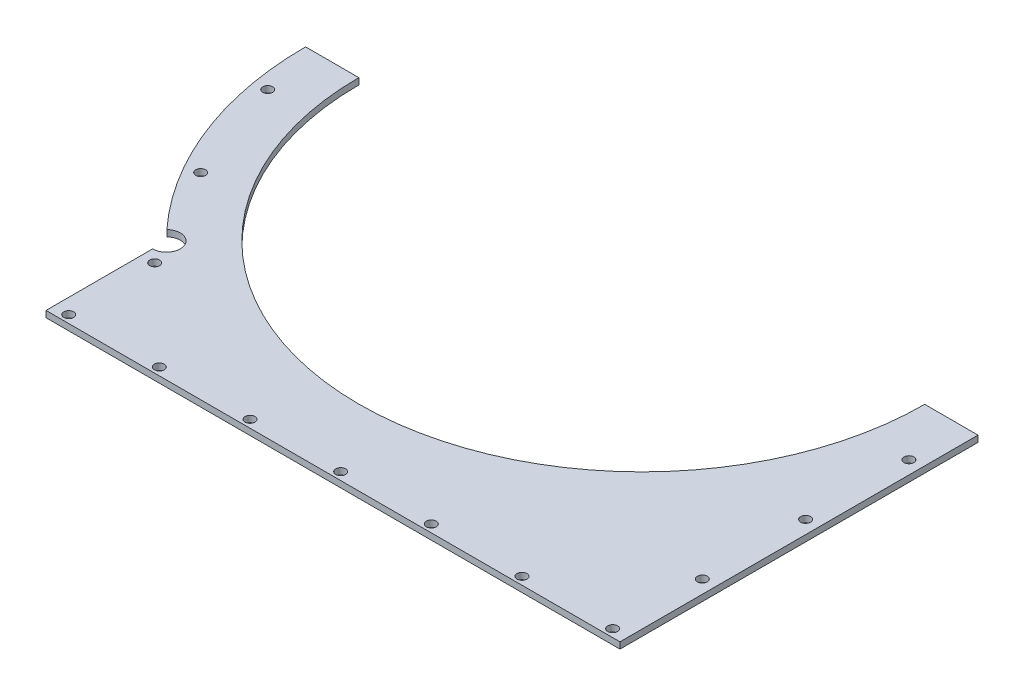
ISO-10303-21;
HEADER;
FILE_DESCRIPTION(('STEP AP214'),'2;1');
FILE_NAME('part.step','',(''),(''),'','','');
FILE_SCHEMA(('AUTOMOTIVE_DESIGN { 1 0 10303 214 1 1 1 1 }'));
ENDSEC;
DATA;
#1=APPLICATION_CONTEXT('core data for automotive mechanical design processes');
#2=APPLICATION_PROTOCOL_DEFINITION('international standard','automotive_design',2000,#1);
#3=PRODUCT_CONTEXT('',#1,'mechanical');
#4=PRODUCT('Part','Part','',(#3));
#5=PRODUCT_RELATED_PRODUCT_CATEGORY('part','',(#4));
#6=PRODUCT_DEFINITION_FORMATION('','',#4);
#7=PRODUCT_DEFINITION_CONTEXT('part definition',#1,'design');
#8=PRODUCT_DEFINITION('design','',#6,#7);
#9=PRODUCT_DEFINITION_SHAPE('','',#8);
#10=(LENGTH_UNIT() NAMED_UNIT(*) SI_UNIT(.MILLI.,.METRE.));
#11=(NAMED_UNIT(*) PLANE_ANGLE_UNIT() SI_UNIT($,.RADIAN.));
#12=(NAMED_UNIT(*) SI_UNIT($,.STERADIAN.) SOLID_ANGLE_UNIT());
#13=UNCERTAINTY_MEASURE_WITH_UNIT(LENGTH_MEASURE(1.E-05),#10,'distance_accuracy_value','');
#14=(GEOMETRIC_REPRESENTATION_CONTEXT(3) GLOBAL_UNCERTAINTY_ASSIGNED_CONTEXT((#13)) GLOBAL_UNIT_ASSIGNED_CONTEXT((#10,
#11,#12)) REPRESENTATION_CONTEXT('',''));
#15=CARTESIAN_POINT('',(0.,0.,0.));
#16=DIRECTION('',(0.,0.,1.));
#17=DIRECTION('',(1.,0.,0.));
#18=AXIS2_PLACEMENT_3D('',#15,#16,#17);
#19=CARTESIAN_POINT('',(128.749975145629,2.8956,0.0799999999999986));
#20=DIRECTION('',(0.,0.,1.));
#21=DIRECTION('',(1.,0.,0.));
#22=AXIS2_PLACEMENT_3D('',#19,#20,#21);
#23=PLANE('',#22);
#24=DIRECTION('',(-1.,0.,0.));
#25=VECTOR('',#24,1.);
#26=CARTESIAN_POINT('',(128.749975145629,0.,0.0799999999999986));
#27=LINE('',#26,#25);
#28=CARTESIAN_POINT('',(153.,0.,0.0799999999999985));
#29=VERTEX_POINT('',#28);
#30=CARTESIAN_POINT('',(128.749975145629,0.,0.0799999999999621));
#31=VERTEX_POINT('',#30);
#32=EDGE_CURVE('E131',#29,#31,#27,.T.);
#33=ORIENTED_EDGE('',*,*,#32,.T.);
#34=DIRECTION('',(0.,-1.,0.));
#35=VECTOR('',#34,1.);
#36=CARTESIAN_POINT('',(128.749975145629,2.8956,0.0799999999999621));
#37=LINE('',#36,#35);
#38=CARTESIAN_POINT('',(128.749975145629,2.8956,0.0799999999999621));
#39=VERTEX_POINT('',#38);
#40=EDGE_CURVE('E41',#39,#31,#37,.T.);
#41=ORIENTED_EDGE('',*,*,#40,.F.);
#42=DIRECTION('',(-1.,0.,0.));
#43=VECTOR('',#42,1.);
#44=CARTESIAN_POINT('',(128.749975145629,2.8956,0.0799999999999986));
#45=LINE('',#44,#43);
#46=CARTESIAN_POINT('',(153.,2.8956,0.0799999999999985));
#47=VERTEX_POINT('',#46);
#48=EDGE_CURVE('E145',#47,#39,#45,.T.);
#49=ORIENTED_EDGE('',*,*,#48,.F.);
#50=DIRECTION('',(0.,-1.,0.));
#51=VECTOR('',#50,1.);
#52=CARTESIAN_POINT('',(153.,2.8956,0.0799999999999985));
#53=LINE('',#52,#51);
#54=EDGE_CURVE('E127',#47,#29,#53,.T.);
#55=ORIENTED_EDGE('',*,*,#54,.T.);
#56=EDGE_LOOP('',(#33,#41,#49,#55));
#57=FACE_BOUND('',#56,.T.);
#58=ADVANCED_FACE('F34',(#57),#23,.F.);
#59=CARTESIAN_POINT('',(0.,2.8956,0.));
#60=DIRECTION('',(0.,-1.,0.));
#61=DIRECTION('',(0.,0.,-1.));
#62=AXIS2_PLACEMENT_3D('',#59,#60,#61);
#63=CYLINDRICAL_SURFACE('',#62,128.75);
#64=CARTESIAN_POINT('',(0.,0.,0.));
#65=DIRECTION('',(0.,-1.,0.));
#66=DIRECTION('',(0.,0.,1.));
#67=AXIS2_PLACEMENT_3D('',#64,#65,#66);
#68=CIRCLE('',#67,128.75);
#69=CARTESIAN_POINT('',(-128.749975145629,0.,0.0800000000000002));
#70=VERTEX_POINT('',#69);
#71=EDGE_CURVE('E134',#31,#70,#68,.T.);
#72=ORIENTED_EDGE('',*,*,#71,.T.);
#73=DIRECTION('',(0.,-1.,0.));
#74=VECTOR('',#73,1.);
#75=CARTESIAN_POINT('',(-128.749975145629,2.8956,0.0800000000000002));
#76=LINE('',#75,#74);
#77=CARTESIAN_POINT('',(-128.749975145629,2.8956,0.0800000000000002));
#78=VERTEX_POINT('',#77);
#79=EDGE_CURVE('E150',#78,#70,#76,.T.);
#80=ORIENTED_EDGE('',*,*,#79,.F.);
#81=CARTESIAN_POINT('',(0.,2.8956,0.));
#82=DIRECTION('',(0.,-1.,0.));
#83=DIRECTION('',(0.,0.,1.));
#84=AXIS2_PLACEMENT_3D('',#81,#82,#83);
#85=CIRCLE('',#84,128.75);
#86=EDGE_CURVE('E92',#39,#78,#85,.T.);
#87=ORIENTED_EDGE('',*,*,#86,.F.);
#88=ORIENTED_EDGE('',*,*,#40,.T.);
#89=EDGE_LOOP('',(#72,#80,#87,#88));
#90=FACE_BOUND('',#89,.T.);
#91=ADVANCED_FACE('F153',(#90),#63,.F.);
#92=CARTESIAN_POINT('',(-152.999979084966,2.8956,0.0800000000000002));
#93=DIRECTION('',(0.,0.,1.));
#94=DIRECTION('',(1.,0.,0.));
#95=AXIS2_PLACEMENT_3D('',#92,#93,#94);
#96=PLANE('',#95);
#97=DIRECTION('',(-1.,0.,0.));
#98=VECTOR('',#97,1.);
#99=CARTESIAN_POINT('',(-152.999979084966,0.,0.0800000000000002));
#100=LINE('',#99,#98);
#101=CARTESIAN_POINT('',(-152.999979084966,0.,0.0799999999999065));
#102=VERTEX_POINT('',#101);
#103=EDGE_CURVE('E136',#70,#102,#100,.T.);
#104=ORIENTED_EDGE('',*,*,#103,.T.);
#105=DIRECTION('',(0.,-1.,0.));
#106=VECTOR('',#105,1.);
#107=CARTESIAN_POINT('',(-152.999979084966,2.8956,0.0799999999999065));
#108=LINE('',#107,#106);
#109=CARTESIAN_POINT('',(-152.999979084966,2.8956,0.0799999999999065));
#110=VERTEX_POINT('',#109);
#111=EDGE_CURVE('E122',#110,#102,#108,.T.);
#112=ORIENTED_EDGE('',*,*,#111,.F.);
#113=DIRECTION('',(-1.,0.,0.));
#114=VECTOR('',#113,1.);
#115=CARTESIAN_POINT('',(-152.999979084966,2.8956,0.0800000000000002));
#116=LINE('',#115,#114);
#117=EDGE_CURVE('E168',#78,#110,#116,.T.);
#118=ORIENTED_EDGE('',*,*,#117,.F.);
#119=ORIENTED_EDGE('',*,*,#79,.T.);
#120=EDGE_LOOP('',(#104,#112,#118,#119));
#121=FACE_BOUND('',#120,.T.);
#122=ADVANCED_FACE('F163',(#121),#96,.F.);
#123=CARTESIAN_POINT('',(0.,2.8956,0.));
#124=DIRECTION('',(0.,-1.,0.));
#125=DIRECTION('',(0.,0.,-1.));
#126=AXIS2_PLACEMENT_3D('',#123,#124,#125);
#127=CYLINDRICAL_SURFACE('',#126,153.);
#128=CARTESIAN_POINT('',(0.,0.,0.));
#129=DIRECTION('',(0.,1.,0.));
#130=DIRECTION('',(0.,0.,1.));
#131=AXIS2_PLACEMENT_3D('',#128,#129,#130);
#132=CIRCLE('',#131,153.);
#133=CARTESIAN_POINT('',(-112.549450099618,0.,103.641793125523));
#134=VERTEX_POINT('',#133);
#135=EDGE_CURVE('E138',#102,#134,#132,.T.);
#136=ORIENTED_EDGE('',*,*,#135,.T.);
#137=DIRECTION('',(0.,-1.,0.));
#138=VECTOR('',#137,1.);
#139=CARTESIAN_POINT('',(-112.549450099618,2.,103.641793125522));
#140=LINE('',#139,#138);
#141=CARTESIAN_POINT('',(-112.549450099618,2.8956,103.641793125523));
#142=VERTEX_POINT('',#141);
#143=EDGE_CURVE('E48',#134,#142,#140,.F.);
#144=ORIENTED_EDGE('',*,*,#143,.T.);
#145=CARTESIAN_POINT('',(0.,2.8956,0.));
#146=DIRECTION('',(0.,1.,0.));
#147=DIRECTION('',(0.,0.,1.));
#148=AXIS2_PLACEMENT_3D('',#145,#146,#147);
#149=CIRCLE('',#148,153.);
#150=EDGE_CURVE('E113',#110,#142,#149,.T.);
#151=ORIENTED_EDGE('',*,*,#150,.F.);
#152=ORIENTED_EDGE('',*,*,#111,.T.);
#153=EDGE_LOOP('',(#136,#144,#151,#152));
#154=FACE_BOUND('',#153,.T.);
#155=ADVANCED_FACE('F167',(#154),#127,.T.);
#156=CARTESIAN_POINT('',(-108.187337521542,2.8956,108.187337521542));
#157=DIRECTION('',(1.,0.,0.));
#158=DIRECTION('',(0.,0.,-1.));
#159=AXIS2_PLACEMENT_3D('',#156,#157,#158);
#160=PLANE('',#159);
#161=DIRECTION('',(0.,0.,1.));
#162=VECTOR('',#161,1.);
#163=CARTESIAN_POINT('',(-108.187337521542,2.8956,108.187337521542));
#164=LINE('',#163,#162);
#165=CARTESIAN_POINT('',(-108.187337521542,2.8956,114.487337521542));
#166=VERTEX_POINT('',#165);
#167=CARTESIAN_POINT('',(-108.187337521542,2.8956,163.));
#168=VERTEX_POINT('',#167);
#169=EDGE_CURVE('E102',#166,#168,#164,.T.);
#170=ORIENTED_EDGE('',*,*,#169,.F.);
#171=DIRECTION('',(0.,-1.,0.));
#172=VECTOR('',#171,1.);
#173=CARTESIAN_POINT('',(-108.187337521542,4.,114.487337521542));
#174=LINE('',#173,#172);
#175=CARTESIAN_POINT('',(-108.187337521542,0.,114.487337521542));
#176=VERTEX_POINT('',#175);
#177=EDGE_CURVE('E174',#166,#176,#174,.T.);
#178=ORIENTED_EDGE('',*,*,#177,.T.);
#179=DIRECTION('',(0.,0.,1.));
#180=VECTOR('',#179,1.);
#181=CARTESIAN_POINT('',(-108.187337521542,0.,108.187337521542));
#182=LINE('',#181,#180);
#183=CARTESIAN_POINT('',(-108.187337521542,0.,163.));
#184=VERTEX_POINT('',#183);
#185=EDGE_CURVE('E119',#176,#184,#182,.T.);
#186=ORIENTED_EDGE('',*,*,#185,.T.);
#187=DIRECTION('',(0.,-1.,0.));
#188=VECTOR('',#187,1.);
#189=CARTESIAN_POINT('',(-108.187337521542,2.8956,163.));
#190=LINE('',#189,#188);
#191=EDGE_CURVE('E116',#168,#184,#190,.T.);
#192=ORIENTED_EDGE('',*,*,#191,.F.);
#193=EDGE_LOOP('',(#170,#178,#186,#192));
#194=FACE_BOUND('',#193,.T.);
#195=ADVANCED_FACE('F117',(#194),#160,.F.);
#196=CARTESIAN_POINT('',(-108.187337521542,2.8956,163.));
#197=DIRECTION('',(0.,0.,-1.));
#198=DIRECTION('',(-1.,0.,0.));
#199=AXIS2_PLACEMENT_3D('',#196,#197,#198);
#200=PLANE('',#199);
#201=DIRECTION('',(1.,0.,0.));
#202=VECTOR('',#201,1.);
#203=CARTESIAN_POINT('',(-108.187337521542,0.,163.));
#204=LINE('',#203,#202);
#205=CARTESIAN_POINT('',(153.,0.,163.));
#206=VERTEX_POINT('',#205);
#207=EDGE_CURVE('E142',#184,#206,#204,.T.);
#208=ORIENTED_EDGE('',*,*,#207,.T.);
#209=DIRECTION('',(0.,-1.,0.));
#210=VECTOR('',#209,1.);
#211=CARTESIAN_POINT('',(153.,2.8956,163.));
#212=LINE('',#211,#210);
#213=CARTESIAN_POINT('',(153.,2.8956,163.));
#214=VERTEX_POINT('',#213);
#215=EDGE_CURVE('E123',#214,#206,#212,.T.);
#216=ORIENTED_EDGE('',*,*,#215,.F.);
#217=DIRECTION('',(1.,0.,0.));
#218=VECTOR('',#217,1.);
#219=CARTESIAN_POINT('',(-108.187337521542,2.8956,163.));
#220=LINE('',#219,#218);
#221=EDGE_CURVE('E106',#168,#214,#220,.T.);
#222=ORIENTED_EDGE('',*,*,#221,.F.);
#223=ORIENTED_EDGE('',*,*,#191,.T.);
#224=EDGE_LOOP('',(#208,#216,#222,#223));
#225=FACE_BOUND('',#224,.T.);
#226=ADVANCED_FACE('F125',(#225),#200,.F.);
#227=CARTESIAN_POINT('',(153.,2.8956,163.));
#228=DIRECTION('',(-1.,0.,0.));
#229=DIRECTION('',(0.,0.,1.));
#230=AXIS2_PLACEMENT_3D('',#227,#228,#229);
#231=PLANE('',#230);
#232=DIRECTION('',(0.,0.,-1.));
#233=VECTOR('',#232,1.);
#234=CARTESIAN_POINT('',(153.,0.,163.));
#235=LINE('',#234,#233);
#236=EDGE_CURVE('E83',#206,#29,#235,.T.);
#237=ORIENTED_EDGE('',*,*,#236,.T.);
#238=ORIENTED_EDGE('',*,*,#54,.F.);
#239=DIRECTION('',(0.,0.,-1.));
#240=VECTOR('',#239,1.);
#241=CARTESIAN_POINT('',(153.,2.8956,163.));
#242=LINE('',#241,#240);
#243=EDGE_CURVE('E56',#214,#47,#242,.T.);
#244=ORIENTED_EDGE('',*,*,#243,.F.);
#245=ORIENTED_EDGE('',*,*,#215,.T.);
#246=EDGE_LOOP('',(#237,#238,#244,#245));
#247=FACE_BOUND('',#246,.T.);
#248=ADVANCED_FACE('F260',(#247),#231,.F.);
#249=CARTESIAN_POINT('',(0.,2.8956,0.));
#250=DIRECTION('',(0.,1.,0.));
#251=DIRECTION('',(0.,0.,1.));
#252=AXIS2_PLACEMENT_3D('',#249,#250,#251);
#253=PLANE('',#252);
#254=CARTESIAN_POINT('',(-144.7667396928,2.8956,25.5262821170323));
#255=DIRECTION('',(0.,1.,0.));
#256=DIRECTION('',(0.,0.,1.));
#257=AXIS2_PLACEMENT_3D('',#254,#255,#256);
#258=CIRCLE('',#257,2.24999999999997);
#259=CARTESIAN_POINT('',(-144.7667396928,2.8956,27.7762821170323));
#260=VERTEX_POINT('',#259);
#261=EDGE_CURVE('E252',#260,#260,#258,.T.);
#262=ORIENTED_EDGE('',*,*,#261,.F.);
#263=EDGE_LOOP('',(#262));
#264=FACE_BOUND('',#263,.T.);
#265=CARTESIAN_POINT('',(-127.305734356317,2.8956,73.4999999999958));
#266=DIRECTION('',(0.,1.,0.));
#267=DIRECTION('',(0.,0.,1.));
#268=AXIS2_PLACEMENT_3D('',#265,#266,#267);
#269=CIRCLE('',#268,2.25);
#270=CARTESIAN_POINT('',(-127.305734356317,2.8956,75.7499999999958));
#271=VERTEX_POINT('',#270);
#272=EDGE_CURVE('E246',#271,#271,#269,.T.);
#273=ORIENTED_EDGE('',*,*,#272,.F.);
#274=EDGE_LOOP('',(#273));
#275=FACE_BOUND('',#274,.T.);
#276=CARTESIAN_POINT('',(-102.2,2.8956,119.526282117032));
#277=DIRECTION('',(0.,1.,0.));
#278=DIRECTION('',(0.,0.,1.));
#279=AXIS2_PLACEMENT_3D('',#276,#277,#278);
#280=CIRCLE('',#279,2.24999999999999);
#281=CARTESIAN_POINT('',(-102.2,2.8956,121.776282117032));
#282=VERTEX_POINT('',#281);
#283=EDGE_CURVE('E240',#282,#282,#280,.T.);
#284=ORIENTED_EDGE('',*,*,#283,.F.);
#285=EDGE_LOOP('',(#284));
#286=FACE_BOUND('',#285,.T.);
#287=CARTESIAN_POINT('',(-101.35,2.8956,159.5));
#288=DIRECTION('',(0.,1.,0.));
#289=DIRECTION('',(0.,0.,1.));
#290=AXIS2_PLACEMENT_3D('',#287,#288,#289);
#291=CIRCLE('',#290,2.24999999999999);
#292=CARTESIAN_POINT('',(-101.35,2.8956,161.75));
#293=VERTEX_POINT('',#292);
#294=EDGE_CURVE('E234',#293,#293,#291,.T.);
#295=ORIENTED_EDGE('',*,*,#294,.F.);
#296=EDGE_LOOP('',(#295));
#297=FACE_BOUND('',#296,.T.);
#298=CARTESIAN_POINT('',(-60.1,2.8956,159.5));
#299=DIRECTION('',(0.,1.,0.));
#300=DIRECTION('',(0.,0.,1.));
#301=AXIS2_PLACEMENT_3D('',#298,#299,#300);
#302=CIRCLE('',#301,2.24999999999999);
#303=CARTESIAN_POINT('',(-60.1,2.8956,161.75));
#304=VERTEX_POINT('',#303);
#305=EDGE_CURVE('E228',#304,#304,#302,.T.);
#306=ORIENTED_EDGE('',*,*,#305,.F.);
#307=EDGE_LOOP('',(#306));
#308=FACE_BOUND('',#307,.T.);
#309=CARTESIAN_POINT('',(-18.85,2.8956,159.5));
#310=DIRECTION('',(0.,1.,0.));
#311=DIRECTION('',(0.,0.,1.));
#312=AXIS2_PLACEMENT_3D('',#309,#310,#311);
#313=CIRCLE('',#312,2.24999999999999);
#314=CARTESIAN_POINT('',(-18.85,2.8956,161.75));
#315=VERTEX_POINT('',#314);
#316=EDGE_CURVE('E222',#315,#315,#313,.T.);
#317=ORIENTED_EDGE('',*,*,#316,.F.);
#318=EDGE_LOOP('',(#317));
#319=FACE_BOUND('',#318,.T.);
#320=CARTESIAN_POINT('',(22.4,2.8956,159.5));
#321=DIRECTION('',(0.,1.,0.));
#322=DIRECTION('',(0.,0.,1.));
#323=AXIS2_PLACEMENT_3D('',#320,#321,#322);
#324=CIRCLE('',#323,2.24999999999999);
#325=CARTESIAN_POINT('',(22.4,2.8956,161.75));
#326=VERTEX_POINT('',#325);
#327=EDGE_CURVE('E216',#326,#326,#324,.T.);
#328=ORIENTED_EDGE('',*,*,#327,.F.);
#329=EDGE_LOOP('',(#328));
#330=FACE_BOUND('',#329,.T.);
#331=CARTESIAN_POINT('',(63.65,2.8956,159.5));
#332=DIRECTION('',(0.,1.,0.));
#333=DIRECTION('',(0.,0.,1.));
#334=AXIS2_PLACEMENT_3D('',#331,#332,#333);
#335=CIRCLE('',#334,2.24999999999999);
#336=CARTESIAN_POINT('',(63.65,2.8956,161.75));
#337=VERTEX_POINT('',#336);
#338=EDGE_CURVE('E210',#337,#337,#335,.T.);
#339=ORIENTED_EDGE('',*,*,#338,.F.);
#340=EDGE_LOOP('',(#339));
#341=FACE_BOUND('',#340,.T.);
#342=CARTESIAN_POINT('',(104.9,2.8956,159.5));
#343=DIRECTION('',(0.,1.,0.));
#344=DIRECTION('',(0.,0.,1.));
#345=AXIS2_PLACEMENT_3D('',#342,#343,#344);
#346=CIRCLE('',#345,2.24999999999999);
#347=CARTESIAN_POINT('',(104.9,2.8956,161.75));
#348=VERTEX_POINT('',#347);
#349=EDGE_CURVE('E204',#348,#348,#346,.T.);
#350=ORIENTED_EDGE('',*,*,#349,.F.);
#351=EDGE_LOOP('',(#350));
#352=FACE_BOUND('',#351,.T.);
#353=CARTESIAN_POINT('',(146.15,2.8956,159.5));
#354=DIRECTION('',(0.,1.,0.));
#355=DIRECTION('',(0.,0.,1.));
#356=AXIS2_PLACEMENT_3D('',#353,#354,#355);
#357=CIRCLE('',#356,2.24999999999997);
#358=CARTESIAN_POINT('',(146.15,2.8956,161.75));
#359=VERTEX_POINT('',#358);
#360=EDGE_CURVE('E198',#359,#359,#357,.T.);
#361=ORIENTED_EDGE('',*,*,#360,.F.);
#362=EDGE_LOOP('',(#361));
#363=FACE_BOUND('',#362,.T.);
#364=CARTESIAN_POINT('',(147.,2.8956,119.526282117032));
#365=DIRECTION('',(0.,1.,0.));
#366=DIRECTION('',(0.,0.,1.));
#367=AXIS2_PLACEMENT_3D('',#364,#365,#366);
#368=CIRCLE('',#367,2.25);
#369=CARTESIAN_POINT('',(147.,2.8956,121.776282117032));
#370=VERTEX_POINT('',#369);
#371=EDGE_CURVE('E192',#370,#370,#368,.T.);
#372=ORIENTED_EDGE('',*,*,#371,.F.);
#373=EDGE_LOOP('',(#372));
#374=FACE_BOUND('',#373,.T.);
#375=CARTESIAN_POINT('',(147.,2.8956,72.5262821170323));
#376=DIRECTION('',(0.,1.,0.));
#377=DIRECTION('',(0.,0.,1.));
#378=AXIS2_PLACEMENT_3D('',#375,#376,#377);
#379=CIRCLE('',#378,2.25);
#380=CARTESIAN_POINT('',(147.,2.8956,74.7762821170323));
#381=VERTEX_POINT('',#380);
#382=EDGE_CURVE('E186',#381,#381,#379,.T.);
#383=ORIENTED_EDGE('',*,*,#382,.F.);
#384=EDGE_LOOP('',(#383));
#385=FACE_BOUND('',#384,.T.);
#386=CARTESIAN_POINT('',(147.,2.8956,25.5262821170323));
#387=DIRECTION('',(0.,1.,0.));
#388=DIRECTION('',(0.,0.,1.));
#389=AXIS2_PLACEMENT_3D('',#386,#387,#388);
#390=CIRCLE('',#389,2.25);
#391=CARTESIAN_POINT('',(147.,2.8956,27.7762821170323));
#392=VERTEX_POINT('',#391);
#393=EDGE_CURVE('E180',#392,#392,#390,.T.);
#394=ORIENTED_EDGE('',*,*,#393,.F.);
#395=EDGE_LOOP('',(#394));
#396=FACE_BOUND('',#395,.T.);
#397=CARTESIAN_POINT('',(-108.187337521542,2.8956,108.187337521542));
#398=DIRECTION('',(0.,1.,0.));
#399=DIRECTION('',(0.,0.,1.));
#400=AXIS2_PLACEMENT_3D('',#397,#398,#399);
#401=CIRCLE('',#400,6.3);
#402=EDGE_CURVE('E110',#166,#142,#401,.T.);
#403=ORIENTED_EDGE('',*,*,#402,.F.);
#404=ORIENTED_EDGE('',*,*,#169,.T.);
#405=ORIENTED_EDGE('',*,*,#221,.T.);
#406=ORIENTED_EDGE('',*,*,#243,.T.);
#407=ORIENTED_EDGE('',*,*,#48,.T.);
#408=ORIENTED_EDGE('',*,*,#86,.T.);
#409=ORIENTED_EDGE('',*,*,#117,.T.);
#410=ORIENTED_EDGE('',*,*,#150,.T.);
#411=EDGE_LOOP('',(#403,#404,#405,#406,#407,#408,#409,#410));
#412=FACE_BOUND('',#411,.T.);
#413=ADVANCED_FACE('F104',(#264,#275,#286,#297,#308,#319,#330,#341,#352,#363,#374,#385,#396,
#412),#253,.T.);
#414=CARTESIAN_POINT('',(0.,0.,0.));
#415=DIRECTION('',(0.,1.,0.));
#416=DIRECTION('',(0.,0.,1.));
#417=AXIS2_PLACEMENT_3D('',#414,#415,#416);
#418=PLANE('',#417);
#419=CARTESIAN_POINT('',(-144.7667396928,0.,25.5262821170323));
#420=DIRECTION('',(0.,1.,0.));
#421=DIRECTION('',(0.,0.,1.));
#422=AXIS2_PLACEMENT_3D('',#419,#420,#421);
#423=CIRCLE('',#422,2.25);
#424=CARTESIAN_POINT('',(-144.7667396928,0.,27.7762821170323));
#425=VERTEX_POINT('',#424);
#426=EDGE_CURVE('E249',#425,#425,#423,.T.);
#427=ORIENTED_EDGE('',*,*,#426,.T.);
#428=EDGE_LOOP('',(#427));
#429=FACE_BOUND('',#428,.T.);
#430=CARTESIAN_POINT('',(-127.305734356317,0.,73.4999999999958));
#431=DIRECTION('',(0.,1.,0.));
#432=DIRECTION('',(0.,0.,1.));
#433=AXIS2_PLACEMENT_3D('',#430,#431,#432);
#434=CIRCLE('',#433,2.25);
#435=CARTESIAN_POINT('',(-127.305734356317,0.,75.7499999999958));
#436=VERTEX_POINT('',#435);
#437=EDGE_CURVE('E243',#436,#436,#434,.T.);
#438=ORIENTED_EDGE('',*,*,#437,.T.);
#439=EDGE_LOOP('',(#438));
#440=FACE_BOUND('',#439,.T.);
#441=CARTESIAN_POINT('',(-102.2,0.,119.526282117032));
#442=DIRECTION('',(0.,1.,0.));
#443=DIRECTION('',(0.,0.,1.));
#444=AXIS2_PLACEMENT_3D('',#441,#442,#443);
#445=CIRCLE('',#444,2.25);
#446=CARTESIAN_POINT('',(-102.2,0.,121.776282117032));
#447=VERTEX_POINT('',#446);
#448=EDGE_CURVE('E237',#447,#447,#445,.T.);
#449=ORIENTED_EDGE('',*,*,#448,.T.);
#450=EDGE_LOOP('',(#449));
#451=FACE_BOUND('',#450,.T.);
#452=CARTESIAN_POINT('',(-101.35,0.,159.5));
#453=DIRECTION('',(0.,1.,0.));
#454=DIRECTION('',(0.,0.,1.));
#455=AXIS2_PLACEMENT_3D('',#452,#453,#454);
#456=CIRCLE('',#455,2.25);
#457=CARTESIAN_POINT('',(-101.35,0.,161.75));
#458=VERTEX_POINT('',#457);
#459=EDGE_CURVE('E231',#458,#458,#456,.T.);
#460=ORIENTED_EDGE('',*,*,#459,.T.);
#461=EDGE_LOOP('',(#460));
#462=FACE_BOUND('',#461,.T.);
#463=CARTESIAN_POINT('',(-60.1,0.,159.5));
#464=DIRECTION('',(0.,1.,0.));
#465=DIRECTION('',(0.,0.,1.));
#466=AXIS2_PLACEMENT_3D('',#463,#464,#465);
#467=CIRCLE('',#466,2.25);
#468=CARTESIAN_POINT('',(-60.1,0.,161.75));
#469=VERTEX_POINT('',#468);
#470=EDGE_CURVE('E225',#469,#469,#467,.T.);
#471=ORIENTED_EDGE('',*,*,#470,.T.);
#472=EDGE_LOOP('',(#471));
#473=FACE_BOUND('',#472,.T.);
#474=CARTESIAN_POINT('',(-18.85,0.,159.5));
#475=DIRECTION('',(0.,1.,0.));
#476=DIRECTION('',(0.,0.,1.));
#477=AXIS2_PLACEMENT_3D('',#474,#475,#476);
#478=CIRCLE('',#477,2.25);
#479=CARTESIAN_POINT('',(-18.85,0.,161.75));
#480=VERTEX_POINT('',#479);
#481=EDGE_CURVE('E219',#480,#480,#478,.T.);
#482=ORIENTED_EDGE('',*,*,#481,.T.);
#483=EDGE_LOOP('',(#482));
#484=FACE_BOUND('',#483,.T.);
#485=CARTESIAN_POINT('',(22.4,0.,159.5));
#486=DIRECTION('',(0.,1.,0.));
#487=DIRECTION('',(0.,0.,1.));
#488=AXIS2_PLACEMENT_3D('',#485,#486,#487);
#489=CIRCLE('',#488,2.25);
#490=CARTESIAN_POINT('',(22.4,0.,161.75));
#491=VERTEX_POINT('',#490);
#492=EDGE_CURVE('E213',#491,#491,#489,.T.);
#493=ORIENTED_EDGE('',*,*,#492,.T.);
#494=EDGE_LOOP('',(#493));
#495=FACE_BOUND('',#494,.T.);
#496=CARTESIAN_POINT('',(63.65,0.,159.5));
#497=DIRECTION('',(0.,1.,0.));
#498=DIRECTION('',(0.,0.,1.));
#499=AXIS2_PLACEMENT_3D('',#496,#497,#498);
#500=CIRCLE('',#499,2.25);
#501=CARTESIAN_POINT('',(63.65,0.,161.75));
#502=VERTEX_POINT('',#501);
#503=EDGE_CURVE('E207',#502,#502,#500,.T.);
#504=ORIENTED_EDGE('',*,*,#503,.T.);
#505=EDGE_LOOP('',(#504));
#506=FACE_BOUND('',#505,.T.);
#507=CARTESIAN_POINT('',(104.9,0.,159.5));
#508=DIRECTION('',(0.,1.,0.));
#509=DIRECTION('',(0.,0.,1.));
#510=AXIS2_PLACEMENT_3D('',#507,#508,#509);
#511=CIRCLE('',#510,2.25);
#512=CARTESIAN_POINT('',(104.9,0.,161.75));
#513=VERTEX_POINT('',#512);
#514=EDGE_CURVE('E201',#513,#513,#511,.T.);
#515=ORIENTED_EDGE('',*,*,#514,.T.);
#516=EDGE_LOOP('',(#515));
#517=FACE_BOUND('',#516,.T.);
#518=CARTESIAN_POINT('',(146.15,0.,159.5));
#519=DIRECTION('',(0.,1.,0.));
#520=DIRECTION('',(0.,0.,1.));
#521=AXIS2_PLACEMENT_3D('',#518,#519,#520);
#522=CIRCLE('',#521,2.25);
#523=CARTESIAN_POINT('',(146.15,0.,161.75));
#524=VERTEX_POINT('',#523);
#525=EDGE_CURVE('E195',#524,#524,#522,.T.);
#526=ORIENTED_EDGE('',*,*,#525,.T.);
#527=EDGE_LOOP('',(#526));
#528=FACE_BOUND('',#527,.T.);
#529=CARTESIAN_POINT('',(147.,0.,119.526282117032));
#530=DIRECTION('',(0.,1.,0.));
#531=DIRECTION('',(0.,0.,1.));
#532=AXIS2_PLACEMENT_3D('',#529,#530,#531);
#533=CIRCLE('',#532,2.25);
#534=CARTESIAN_POINT('',(147.,0.,121.776282117032));
#535=VERTEX_POINT('',#534);
#536=EDGE_CURVE('E189',#535,#535,#533,.T.);
#537=ORIENTED_EDGE('',*,*,#536,.T.);
#538=EDGE_LOOP('',(#537));
#539=FACE_BOUND('',#538,.T.);
#540=CARTESIAN_POINT('',(147.,0.,72.5262821170323));
#541=DIRECTION('',(0.,1.,0.));
#542=DIRECTION('',(0.,0.,1.));
#543=AXIS2_PLACEMENT_3D('',#540,#541,#542);
#544=CIRCLE('',#543,2.25);
#545=CARTESIAN_POINT('',(147.,0.,74.7762821170323));
#546=VERTEX_POINT('',#545);
#547=EDGE_CURVE('E183',#546,#546,#544,.T.);
#548=ORIENTED_EDGE('',*,*,#547,.T.);
#549=EDGE_LOOP('',(#548));
#550=FACE_BOUND('',#549,.T.);
#551=CARTESIAN_POINT('',(147.,0.,25.5262821170323));
#552=DIRECTION('',(0.,1.,0.));
#553=DIRECTION('',(0.,0.,1.));
#554=AXIS2_PLACEMENT_3D('',#551,#552,#553);
#555=CIRCLE('',#554,2.25);
#556=CARTESIAN_POINT('',(147.,0.,27.7762821170323));
#557=VERTEX_POINT('',#556);
#558=EDGE_CURVE('E177',#557,#557,#555,.T.);
#559=ORIENTED_EDGE('',*,*,#558,.T.);
#560=EDGE_LOOP('',(#559));
#561=FACE_BOUND('',#560,.T.);
#562=ORIENTED_EDGE('',*,*,#185,.F.);
#563=CARTESIAN_POINT('',(-108.187337521542,0.,108.187337521542));
#564=DIRECTION('',(0.,1.,0.));
#565=DIRECTION('',(0.,0.,1.));
#566=AXIS2_PLACEMENT_3D('',#563,#564,#565);
#567=CIRCLE('',#566,6.3);
#568=EDGE_CURVE('E11',#176,#134,#567,.T.);
#569=ORIENTED_EDGE('',*,*,#568,.T.);
#570=ORIENTED_EDGE('',*,*,#135,.F.);
#571=ORIENTED_EDGE('',*,*,#103,.F.);
#572=ORIENTED_EDGE('',*,*,#71,.F.);
#573=ORIENTED_EDGE('',*,*,#32,.F.);
#574=ORIENTED_EDGE('',*,*,#236,.F.);
#575=ORIENTED_EDGE('',*,*,#207,.F.);
#576=EDGE_LOOP('',(#562,#569,#570,#571,#572,#573,#574,#575));
#577=FACE_BOUND('',#576,.T.);
#578=ADVANCED_FACE('F158',(#429,#440,#451,#462,#473,#484,#495,#506,#517,#528,#539,#550,#561,
#577),#418,.F.);
#579=CARTESIAN_POINT('',(-108.187337521542,4.,108.187337521542));
#580=DIRECTION('',(0.,-1.,0.));
#581=DIRECTION('',(0.,0.,-1.));
#582=AXIS2_PLACEMENT_3D('',#579,#580,#581);
#583=CYLINDRICAL_SURFACE('',#582,6.3);
#584=ORIENTED_EDGE('',*,*,#568,.F.);
#585=ORIENTED_EDGE('',*,*,#177,.F.);
#586=ORIENTED_EDGE('',*,*,#402,.T.);
#587=ORIENTED_EDGE('',*,*,#143,.F.);
#588=EDGE_LOOP('',(#584,#585,#586,#587));
#589=FACE_BOUND('',#588,.T.);
#590=ADVANCED_FACE('F289',(#589),#583,.F.);
#591=CARTESIAN_POINT('',(147.,2.8956,25.5262821170323));
#592=DIRECTION('',(0.,1.,0.));
#593=DIRECTION('',(0.,0.,1.));
#594=AXIS2_PLACEMENT_3D('',#591,#592,#593);
#595=CYLINDRICAL_SURFACE('',#594,2.25);
#596=ORIENTED_EDGE('',*,*,#558,.F.);
#597=EDGE_LOOP('',(#596));
#598=FACE_BOUND('',#597,.T.);
#599=ORIENTED_EDGE('',*,*,#393,.T.);
#600=EDGE_LOOP('',(#599));
#601=FACE_BOUND('',#600,.T.);
#602=ADVANCED_FACE('F286',(#598,#601),#595,.F.);
#603=CARTESIAN_POINT('',(147.,2.8956,72.5262821170323));
#604=DIRECTION('',(0.,1.,0.));
#605=DIRECTION('',(0.,0.,1.));
#606=AXIS2_PLACEMENT_3D('',#603,#604,#605);
#607=CYLINDRICAL_SURFACE('',#606,2.25);
#608=ORIENTED_EDGE('',*,*,#547,.F.);
#609=EDGE_LOOP('',(#608));
#610=FACE_BOUND('',#609,.T.);
#611=ORIENTED_EDGE('',*,*,#382,.T.);
#612=EDGE_LOOP('',(#611));
#613=FACE_BOUND('',#612,.T.);
#614=ADVANCED_FACE('F288',(#610,#613),#607,.F.);
#615=CARTESIAN_POINT('',(147.,2.8956,119.526282117032));
#616=DIRECTION('',(0.,1.,0.));
#617=DIRECTION('',(0.,0.,1.));
#618=AXIS2_PLACEMENT_3D('',#615,#616,#617);
#619=CYLINDRICAL_SURFACE('',#618,2.25);
#620=ORIENTED_EDGE('',*,*,#536,.F.);
#621=EDGE_LOOP('',(#620));
#622=FACE_BOUND('',#621,.T.);
#623=ORIENTED_EDGE('',*,*,#371,.T.);
#624=EDGE_LOOP('',(#623));
#625=FACE_BOUND('',#624,.T.);
#626=ADVANCED_FACE('F296',(#622,#625),#619,.F.);
#627=CARTESIAN_POINT('',(146.15,2.8956,159.5));
#628=DIRECTION('',(0.,1.,0.));
#629=DIRECTION('',(0.,0.,1.));
#630=AXIS2_PLACEMENT_3D('',#627,#628,#629);
#631=CYLINDRICAL_SURFACE('',#630,2.24999999999999);
#632=ORIENTED_EDGE('',*,*,#525,.F.);
#633=EDGE_LOOP('',(#632));
#634=FACE_BOUND('',#633,.T.);
#635=ORIENTED_EDGE('',*,*,#360,.T.);
#636=EDGE_LOOP('',(#635));
#637=FACE_BOUND('',#636,.T.);
#638=ADVANCED_FACE('F350',(#634,#637),#631,.F.);
#639=CARTESIAN_POINT('',(104.9,2.8956,159.5));
#640=DIRECTION('',(0.,1.,0.));
#641=DIRECTION('',(0.,0.,1.));
#642=AXIS2_PLACEMENT_3D('',#639,#640,#641);
#643=CYLINDRICAL_SURFACE('',#642,2.25);
#644=ORIENTED_EDGE('',*,*,#514,.F.);
#645=EDGE_LOOP('',(#644));
#646=FACE_BOUND('',#645,.T.);
#647=ORIENTED_EDGE('',*,*,#349,.T.);
#648=EDGE_LOOP('',(#647));
#649=FACE_BOUND('',#648,.T.);
#650=ADVANCED_FACE('F355',(#646,#649),#643,.F.);
#651=CARTESIAN_POINT('',(63.65,2.8956,159.5));
#652=DIRECTION('',(0.,1.,0.));
#653=DIRECTION('',(0.,0.,1.));
#654=AXIS2_PLACEMENT_3D('',#651,#652,#653);
#655=CYLINDRICAL_SURFACE('',#654,2.25);
#656=ORIENTED_EDGE('',*,*,#503,.F.);
#657=EDGE_LOOP('',(#656));
#658=FACE_BOUND('',#657,.T.);
#659=ORIENTED_EDGE('',*,*,#338,.T.);
#660=EDGE_LOOP('',(#659));
#661=FACE_BOUND('',#660,.T.);
#662=ADVANCED_FACE('F361',(#658,#661),#655,.F.);
#663=CARTESIAN_POINT('',(22.4,2.8956,159.5));
#664=DIRECTION('',(0.,1.,0.));
#665=DIRECTION('',(0.,0.,1.));
#666=AXIS2_PLACEMENT_3D('',#663,#664,#665);
#667=CYLINDRICAL_SURFACE('',#666,2.24999999999999);
#668=ORIENTED_EDGE('',*,*,#492,.F.);
#669=EDGE_LOOP('',(#668));
#670=FACE_BOUND('',#669,.T.);
#671=ORIENTED_EDGE('',*,*,#327,.T.);
#672=EDGE_LOOP('',(#671));
#673=FACE_BOUND('',#672,.T.);
#674=ADVANCED_FACE('F365',(#670,#673),#667,.F.);
#675=CARTESIAN_POINT('',(-18.85,2.8956,159.5));
#676=DIRECTION('',(0.,1.,0.));
#677=DIRECTION('',(0.,0.,1.));
#678=AXIS2_PLACEMENT_3D('',#675,#676,#677);
#679=CYLINDRICAL_SURFACE('',#678,2.24999999999999);
#680=ORIENTED_EDGE('',*,*,#481,.F.);
#681=EDGE_LOOP('',(#680));
#682=FACE_BOUND('',#681,.T.);
#683=ORIENTED_EDGE('',*,*,#316,.T.);
#684=EDGE_LOOP('',(#683));
#685=FACE_BOUND('',#684,.T.);
#686=ADVANCED_FACE('F369',(#682,#685),#679,.F.);
#687=CARTESIAN_POINT('',(-60.1,2.8956,159.5));
#688=DIRECTION('',(0.,1.,0.));
#689=DIRECTION('',(0.,0.,1.));
#690=AXIS2_PLACEMENT_3D('',#687,#688,#689);
#691=CYLINDRICAL_SURFACE('',#690,2.25);
#692=ORIENTED_EDGE('',*,*,#470,.F.);
#693=EDGE_LOOP('',(#692));
#694=FACE_BOUND('',#693,.T.);
#695=ORIENTED_EDGE('',*,*,#305,.T.);
#696=EDGE_LOOP('',(#695));
#697=FACE_BOUND('',#696,.T.);
#698=ADVANCED_FACE('F373',(#694,#697),#691,.F.);
#699=CARTESIAN_POINT('',(-101.35,2.8956,159.5));
#700=DIRECTION('',(0.,1.,0.));
#701=DIRECTION('',(0.,0.,1.));
#702=AXIS2_PLACEMENT_3D('',#699,#700,#701);
#703=CYLINDRICAL_SURFACE('',#702,2.25);
#704=ORIENTED_EDGE('',*,*,#459,.F.);
#705=EDGE_LOOP('',(#704));
#706=FACE_BOUND('',#705,.T.);
#707=ORIENTED_EDGE('',*,*,#294,.T.);
#708=EDGE_LOOP('',(#707));
#709=FACE_BOUND('',#708,.T.);
#710=ADVANCED_FACE('F377',(#706,#709),#703,.F.);
#711=CARTESIAN_POINT('',(-102.2,2.8956,119.526282117032));
#712=DIRECTION('',(0.,1.,0.));
#713=DIRECTION('',(0.,0.,1.));
#714=AXIS2_PLACEMENT_3D('',#711,#712,#713);
#715=CYLINDRICAL_SURFACE('',#714,2.25);
#716=ORIENTED_EDGE('',*,*,#448,.F.);
#717=EDGE_LOOP('',(#716));
#718=FACE_BOUND('',#717,.T.);
#719=ORIENTED_EDGE('',*,*,#283,.T.);
#720=EDGE_LOOP('',(#719));
#721=FACE_BOUND('',#720,.T.);
#722=ADVANCED_FACE('F381',(#718,#721),#715,.F.);
#723=CARTESIAN_POINT('',(-127.305734356317,2.8956,73.4999999999958));
#724=DIRECTION('',(0.,1.,0.));
#725=DIRECTION('',(0.,0.,1.));
#726=AXIS2_PLACEMENT_3D('',#723,#724,#725);
#727=CYLINDRICAL_SURFACE('',#726,2.25);
#728=ORIENTED_EDGE('',*,*,#437,.F.);
#729=EDGE_LOOP('',(#728));
#730=FACE_BOUND('',#729,.T.);
#731=ORIENTED_EDGE('',*,*,#272,.T.);
#732=EDGE_LOOP('',(#731));
#733=FACE_BOUND('',#732,.T.);
#734=ADVANCED_FACE('F385',(#730,#733),#727,.F.);
#735=CARTESIAN_POINT('',(-144.7667396928,2.8956,25.5262821170323));
#736=DIRECTION('',(0.,1.,0.));
#737=DIRECTION('',(0.,0.,1.));
#738=AXIS2_PLACEMENT_3D('',#735,#736,#737);
#739=CYLINDRICAL_SURFACE('',#738,2.24999999999999);
#740=ORIENTED_EDGE('',*,*,#426,.F.);
#741=EDGE_LOOP('',(#740));
#742=FACE_BOUND('',#741,.T.);
#743=ORIENTED_EDGE('',*,*,#261,.T.);
#744=EDGE_LOOP('',(#743));
#745=FACE_BOUND('',#744,.T.);
#746=ADVANCED_FACE('F256',(#742,#745),#739,.F.);
#747=CLOSED_SHELL('',(#58,#91,#122,#155,#195,#226,#248,#413,#578,#590,#602,#614,#626,#638,#650,
#662,#674,#686,#698,#710,#722,#734,#746));
#748=MANIFOLD_SOLID_BREP('B2',#747);
#749=ADVANCED_BREP_SHAPE_REPRESENTATION('',(#18,#748),#14);
#750=SHAPE_DEFINITION_REPRESENTATION(#9,#749);
ENDSEC;
END-ISO-10303-21;
